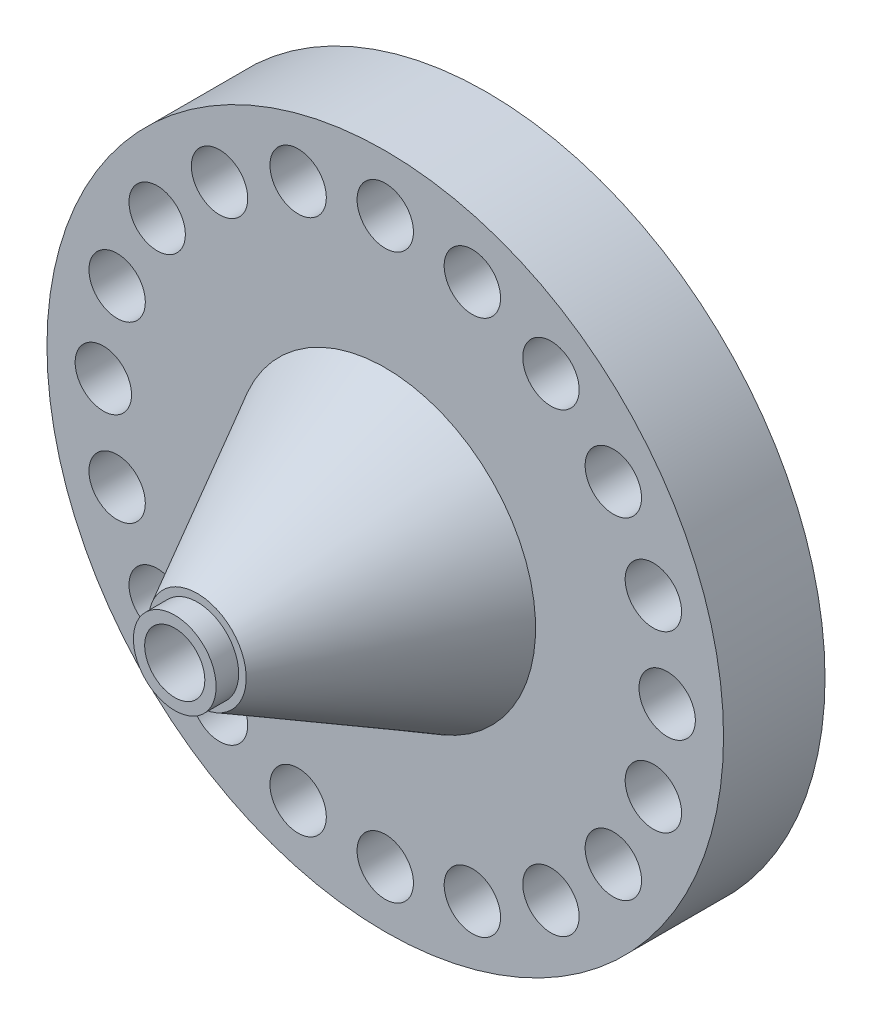
ISO-10303-21;
HEADER;
FILE_DESCRIPTION(('STEP AP214'),'2;1');
FILE_NAME('part.step','',(''),(''),'','','');
FILE_SCHEMA(('AUTOMOTIVE_DESIGN { 1 0 10303 214 1 1 1 1 }'));
ENDSEC;
DATA;
#1=APPLICATION_CONTEXT('core data for automotive mechanical design processes');
#2=APPLICATION_PROTOCOL_DEFINITION('international standard','automotive_design',2000,#1);
#3=PRODUCT_CONTEXT('',#1,'mechanical');
#4=PRODUCT('Part','Part','',(#3));
#5=PRODUCT_RELATED_PRODUCT_CATEGORY('part','',(#4));
#6=PRODUCT_DEFINITION_FORMATION('','',#4);
#7=PRODUCT_DEFINITION_CONTEXT('part definition',#1,'design');
#8=PRODUCT_DEFINITION('design','',#6,#7);
#9=PRODUCT_DEFINITION_SHAPE('','',#8);
#10=(LENGTH_UNIT() NAMED_UNIT(*) SI_UNIT(.MILLI.,.METRE.));
#11=(NAMED_UNIT(*) PLANE_ANGLE_UNIT() SI_UNIT($,.RADIAN.));
#12=(NAMED_UNIT(*) SI_UNIT($,.STERADIAN.) SOLID_ANGLE_UNIT());
#13=UNCERTAINTY_MEASURE_WITH_UNIT(LENGTH_MEASURE(1.E-05),#10,'distance_accuracy_value','');
#14=(GEOMETRIC_REPRESENTATION_CONTEXT(3) GLOBAL_UNCERTAINTY_ASSIGNED_CONTEXT((#13)) GLOBAL_UNIT_ASSIGNED_CONTEXT((#10,
#11,#12)) REPRESENTATION_CONTEXT('',''));
#15=CARTESIAN_POINT('',(0.,0.,0.));
#16=DIRECTION('',(0.,0.,1.));
#17=DIRECTION('',(1.,0.,0.));
#18=AXIS2_PLACEMENT_3D('',#15,#16,#17);
#19=CARTESIAN_POINT('',(0.,0.,-6.75));
#20=DIRECTION('',(0.,0.,1.));
#21=DIRECTION('',(1.,0.,0.));
#22=AXIS2_PLACEMENT_3D('',#19,#20,#21);
#23=CYLINDRICAL_SURFACE('',#22,4.);
#24=CARTESIAN_POINT('',(0.,0.,34.75));
#25=DIRECTION('',(0.,0.,1.));
#26=DIRECTION('',(1.,0.,0.));
#27=AXIS2_PLACEMENT_3D('',#24,#25,#26);
#28=CIRCLE('',#27,4.);
#29=CARTESIAN_POINT('',(4.,0.,34.75));
#30=VERTEX_POINT('',#29);
#31=EDGE_CURVE('E193',#30,#30,#28,.T.);
#32=ORIENTED_EDGE('',*,*,#31,.T.);
#33=EDGE_LOOP('',(#32));
#34=FACE_BOUND('',#33,.T.);
#35=CARTESIAN_POINT('',(0.,0.,-4.75));
#36=DIRECTION('',(0.,0.,-1.));
#37=DIRECTION('',(-1.,0.,0.));
#38=AXIS2_PLACEMENT_3D('',#35,#36,#37);
#39=CIRCLE('',#38,4.);
#40=CARTESIAN_POINT('',(-4.,0.,-4.75));
#41=VERTEX_POINT('',#40);
#42=EDGE_CURVE('E40',#41,#41,#39,.F.);
#43=ORIENTED_EDGE('',*,*,#42,.F.);
#44=EDGE_LOOP('',(#43));
#45=FACE_BOUND('',#44,.T.);
#46=ADVANCED_FACE('F36',(#34,#45),#23,.F.);
#47=CARTESIAN_POINT('',(0.,0.,6.75));
#48=DIRECTION('',(0.,0.,1.));
#49=DIRECTION('',(1.,0.,0.));
#50=AXIS2_PLACEMENT_3D('',#47,#48,#49);
#51=PLANE('',#50);
#52=CARTESIAN_POINT('',(-11.5881372890601,35.6646193610684,6.75));
#53=DIRECTION('',(0.,0.,1.));
#54=DIRECTION('',(1.,0.,0.));
#55=AXIS2_PLACEMENT_3D('',#52,#53,#54);
#56=CIRCLE('',#55,3.75);
#57=CARTESIAN_POINT('',(-7.83813728906006,35.6646193610684,6.75));
#58=VERTEX_POINT('',#57);
#59=EDGE_CURVE('E397',#58,#58,#56,.T.);
#60=ORIENTED_EDGE('',*,*,#59,.F.);
#61=EDGE_LOOP('',(#60));
#62=FACE_BOUND('',#61,.T.);
#63=CARTESIAN_POINT('',(-30.3381372890599,22.0419469609664,6.75));
#64=DIRECTION('',(0.,0.,1.));
#65=DIRECTION('',(1.,0.,0.));
#66=AXIS2_PLACEMENT_3D('',#63,#64,#65);
#67=CIRCLE('',#66,3.75000000000145);
#68=CARTESIAN_POINT('',(-26.5881372890584,22.0419469609664,6.75));
#69=VERTEX_POINT('',#68);
#70=EDGE_CURVE('E409',#69,#69,#67,.T.);
#71=ORIENTED_EDGE('',*,*,#70,.F.);
#72=EDGE_LOOP('',(#71));
#73=FACE_BOUND('',#72,.T.);
#74=CARTESIAN_POINT('',(-37.4999999999984,-1.59642494271182E-12,6.75));
#75=DIRECTION('',(0.,0.,1.));
#76=DIRECTION('',(1.,0.,0.));
#77=AXIS2_PLACEMENT_3D('',#74,#75,#76);
#78=CIRCLE('',#77,3.75000000000237);
#79=CARTESIAN_POINT('',(-33.749999999996,-1.59642494271182E-12,6.75));
#80=VERTEX_POINT('',#79);
#81=EDGE_CURVE('E421',#80,#80,#78,.T.);
#82=ORIENTED_EDGE('',*,*,#81,.F.);
#83=EDGE_LOOP('',(#82));
#84=FACE_BOUND('',#83,.T.);
#85=CARTESIAN_POINT('',(-30.338137289058,-22.041946960969,6.75));
#86=DIRECTION('',(0.,0.,1.));
#87=DIRECTION('',(1.,0.,0.));
#88=AXIS2_PLACEMENT_3D('',#85,#86,#87);
#89=CIRCLE('',#88,3.75000000000315);
#90=CARTESIAN_POINT('',(-26.5881372890549,-22.041946960969,6.75));
#91=VERTEX_POINT('',#90);
#92=EDGE_CURVE('E433',#91,#91,#89,.T.);
#93=ORIENTED_EDGE('',*,*,#92,.F.);
#94=EDGE_LOOP('',(#93));
#95=FACE_BOUND('',#94,.T.);
#96=CARTESIAN_POINT('',(-11.5881372890574,-35.6646193610688,6.75));
#97=DIRECTION('',(0.,0.,1.));
#98=DIRECTION('',(1.,0.,0.));
#99=AXIS2_PLACEMENT_3D('',#96,#97,#98);
#100=CIRCLE('',#99,3.7500000000034);
#101=CARTESIAN_POINT('',(-7.83813728905402,-35.6646193610688,6.75));
#102=VERTEX_POINT('',#101);
#103=EDGE_CURVE('E445',#102,#102,#100,.T.);
#104=ORIENTED_EDGE('',*,*,#103,.F.);
#105=EDGE_LOOP('',(#104));
#106=FACE_BOUND('',#105,.T.);
#107=CARTESIAN_POINT('',(11.5881372890636,-35.6646193610678,6.75));
#108=DIRECTION('',(0.,0.,1.));
#109=DIRECTION('',(1.,0.,0.));
#110=AXIS2_PLACEMENT_3D('',#107,#108,#109);
#111=CIRCLE('',#110,3.75000000000307);
#112=CARTESIAN_POINT('',(15.3381372890667,-35.6646193610678,6.75));
#113=VERTEX_POINT('',#112);
#114=EDGE_CURVE('E457',#113,#113,#111,.T.);
#115=ORIENTED_EDGE('',*,*,#114,.F.);
#116=EDGE_LOOP('',(#115));
#117=FACE_BOUND('',#116,.T.);
#118=CARTESIAN_POINT('',(30.3381372890631,-22.0419469609665,6.75));
#119=DIRECTION('',(0.,0.,1.));
#120=DIRECTION('',(1.,0.,0.));
#121=AXIS2_PLACEMENT_3D('',#118,#119,#120);
#122=CIRCLE('',#121,3.75000000000222);
#123=CARTESIAN_POINT('',(34.0881372890653,-22.0419469609665,6.75));
#124=VERTEX_POINT('',#123);
#125=EDGE_CURVE('E469',#124,#124,#122,.T.);
#126=ORIENTED_EDGE('',*,*,#125,.F.);
#127=EDGE_LOOP('',(#126));
#128=FACE_BOUND('',#127,.T.);
#129=CARTESIAN_POINT('',(37.5000000000016,1.59183251721502E-12,6.75));
#130=DIRECTION('',(0.,0.,1.));
#131=DIRECTION('',(1.,0.,0.));
#132=AXIS2_PLACEMENT_3D('',#129,#130,#131);
#133=CIRCLE('',#132,3.75000000000119);
#134=CARTESIAN_POINT('',(41.2500000000028,1.59183251721502E-12,6.75));
#135=VERTEX_POINT('',#134);
#136=EDGE_CURVE('E481',#135,#135,#133,.T.);
#137=ORIENTED_EDGE('',*,*,#136,.F.);
#138=EDGE_LOOP('',(#137));
#139=FACE_BOUND('',#138,.T.);
#140=CARTESIAN_POINT('',(30.3381372890612,22.041946960969,6.75));
#141=DIRECTION('',(0.,0.,1.));
#142=DIRECTION('',(1.,0.,0.));
#143=AXIS2_PLACEMENT_3D('',#140,#141,#142);
#144=CIRCLE('',#143,3.75000000000033);
#145=CARTESIAN_POINT('',(34.0881372890615,22.041946960969,6.75));
#146=VERTEX_POINT('',#145);
#147=EDGE_CURVE('E493',#146,#146,#144,.T.);
#148=ORIENTED_EDGE('',*,*,#147,.F.);
#149=EDGE_LOOP('',(#148));
#150=FACE_BOUND('',#149,.T.);
#151=CARTESIAN_POINT('',(11.5881372890606,35.6646193610683,6.75));
#152=DIRECTION('',(0.,0.,1.));
#153=DIRECTION('',(1.,0.,0.));
#154=AXIS2_PLACEMENT_3D('',#151,#152,#153);
#155=CIRCLE('',#154,3.75);
#156=CARTESIAN_POINT('',(15.3381372890606,35.6646193610683,6.75));
#157=VERTEX_POINT('',#156);
#158=EDGE_CURVE('E505',#157,#157,#155,.T.);
#159=ORIENTED_EDGE('',*,*,#158,.F.);
#160=EDGE_LOOP('',(#159));
#161=FACE_BOUND('',#160,.T.);
#162=CARTESIAN_POINT('',(0.,0.,6.75));
#163=DIRECTION('',(0.,0.,1.));
#164=DIRECTION('',(1.,0.,0.));
#165=AXIS2_PLACEMENT_3D('',#162,#163,#164);
#166=CIRCLE('',#165,45.);
#167=CARTESIAN_POINT('',(45.,0.,6.75));
#168=VERTEX_POINT('',#167);
#169=EDGE_CURVE('E44',#168,#168,#166,.T.);
#170=ORIENTED_EDGE('',*,*,#169,.T.);
#171=EDGE_LOOP('',(#170));
#172=FACE_BOUND('',#171,.T.);
#173=CARTESIAN_POINT('',(0.,37.5,6.75));
#174=DIRECTION('',(0.,0.,1.));
#175=DIRECTION('',(1.,0.,0.));
#176=AXIS2_PLACEMENT_3D('',#173,#174,#175);
#177=CIRCLE('',#176,3.75);
#178=CARTESIAN_POINT('',(3.75,37.5,6.75));
#179=VERTEX_POINT('',#178);
#180=EDGE_CURVE('E511',#179,#179,#177,.T.);
#181=ORIENTED_EDGE('',*,*,#180,.F.);
#182=EDGE_LOOP('',(#181));
#183=FACE_BOUND('',#182,.T.);
#184=CARTESIAN_POINT('',(22.0419469609678,30.3381372890605,6.75));
#185=DIRECTION('',(0.,0.,1.));
#186=DIRECTION('',(1.,0.,0.));
#187=AXIS2_PLACEMENT_3D('',#184,#185,#186);
#188=CIRCLE('',#187,3.75);
#189=CARTESIAN_POINT('',(25.7919469609678,30.3381372890605,6.75));
#190=VERTEX_POINT('',#189);
#191=EDGE_CURVE('E499',#190,#190,#188,.T.);
#192=ORIENTED_EDGE('',*,*,#191,.F.);
#193=EDGE_LOOP('',(#192));
#194=FACE_BOUND('',#193,.T.);
#195=CARTESIAN_POINT('',(35.6646193610694,11.588137289062,6.75));
#196=DIRECTION('',(0.,0.,1.));
#197=DIRECTION('',(1.,0.,0.));
#198=AXIS2_PLACEMENT_3D('',#195,#196,#197);
#199=CIRCLE('',#198,3.75000000000072);
#200=CARTESIAN_POINT('',(39.4146193610701,11.588137289062,6.75));
#201=VERTEX_POINT('',#200);
#202=EDGE_CURVE('E487',#201,#201,#199,.T.);
#203=ORIENTED_EDGE('',*,*,#202,.F.);
#204=EDGE_LOOP('',(#203));
#205=FACE_BOUND('',#204,.T.);
#206=CARTESIAN_POINT('',(35.6646193610703,-11.588137289059,6.75));
#207=DIRECTION('',(0.,0.,1.));
#208=DIRECTION('',(1.,0.,0.));
#209=AXIS2_PLACEMENT_3D('',#206,#207,#208);
#210=CIRCLE('',#209,3.75000000000171);
#211=CARTESIAN_POINT('',(39.414619361072,-11.588137289059,6.75));
#212=VERTEX_POINT('',#211);
#213=EDGE_CURVE('E475',#212,#212,#210,.T.);
#214=ORIENTED_EDGE('',*,*,#213,.F.);
#215=EDGE_LOOP('',(#214));
#216=FACE_BOUND('',#215,.T.);
#217=CARTESIAN_POINT('',(22.0419469609706,-30.3381372890596,6.75));
#218=DIRECTION('',(0.,0.,1.));
#219=DIRECTION('',(1.,0.,0.));
#220=AXIS2_PLACEMENT_3D('',#217,#218,#219);
#221=CIRCLE('',#220,3.75000000000269);
#222=CARTESIAN_POINT('',(25.7919469609733,-30.3381372890596,6.75));
#223=VERTEX_POINT('',#222);
#224=EDGE_CURVE('E463',#223,#223,#221,.T.);
#225=ORIENTED_EDGE('',*,*,#224,.F.);
#226=EDGE_LOOP('',(#225));
#227=FACE_BOUND('',#226,.T.);
#228=CARTESIAN_POINT('',(3.18366503443004E-12,-37.5,6.75));
#229=DIRECTION('',(0.,0.,1.));
#230=DIRECTION('',(1.,0.,0.));
#231=AXIS2_PLACEMENT_3D('',#228,#229,#230);
#232=CIRCLE('',#231,3.7500000000033);
#233=CARTESIAN_POINT('',(3.75000000000648,-37.5,6.75));
#234=VERTEX_POINT('',#233);
#235=EDGE_CURVE('E451',#234,#234,#232,.T.);
#236=ORIENTED_EDGE('',*,*,#235,.F.);
#237=EDGE_LOOP('',(#236));
#238=FACE_BOUND('',#237,.T.);
#239=CARTESIAN_POINT('',(-22.0419469609649,-30.3381372890615,6.75));
#240=DIRECTION('',(0.,0.,1.));
#241=DIRECTION('',(1.,0.,0.));
#242=AXIS2_PLACEMENT_3D('',#239,#240,#241);
#243=CIRCLE('',#242,3.75000000000334);
#244=CARTESIAN_POINT('',(-18.2919469609615,-30.3381372890615,6.75));
#245=VERTEX_POINT('',#244);
#246=EDGE_CURVE('E439',#245,#245,#243,.T.);
#247=ORIENTED_EDGE('',*,*,#246,.F.);
#248=EDGE_LOOP('',(#247));
#249=FACE_BOUND('',#248,.T.);
#250=CARTESIAN_POINT('',(-35.6646193610662,-11.588137289062,6.75));
#251=DIRECTION('',(0.,0.,1.));
#252=DIRECTION('',(1.,0.,0.));
#253=AXIS2_PLACEMENT_3D('',#250,#251,#252);
#254=CIRCLE('',#253,3.75000000000279);
#255=CARTESIAN_POINT('',(-31.9146193610634,-11.588137289062,6.75));
#256=VERTEX_POINT('',#255);
#257=EDGE_CURVE('E427',#256,#256,#254,.T.);
#258=ORIENTED_EDGE('',*,*,#257,.F.);
#259=EDGE_LOOP('',(#258));
#260=FACE_BOUND('',#259,.T.);
#261=CARTESIAN_POINT('',(-35.6646193610672,11.588137289059,6.75));
#262=DIRECTION('',(0.,0.,1.));
#263=DIRECTION('',(1.,0.,0.));
#264=AXIS2_PLACEMENT_3D('',#261,#262,#263);
#265=CIRCLE('',#264,3.75000000000191);
#266=CARTESIAN_POINT('',(-31.9146193610653,11.588137289059,6.75));
#267=VERTEX_POINT('',#266);
#268=EDGE_CURVE('E415',#267,#267,#265,.T.);
#269=ORIENTED_EDGE('',*,*,#268,.F.);
#270=EDGE_LOOP('',(#269));
#271=FACE_BOUND('',#270,.T.);
#272=CARTESIAN_POINT('',(-22.0419469609674,30.3381372890596,6.75));
#273=DIRECTION('',(0.,0.,1.));
#274=DIRECTION('',(1.,0.,0.));
#275=AXIS2_PLACEMENT_3D('',#272,#273,#274);
#276=CIRCLE('',#275,3.75000000000104);
#277=CARTESIAN_POINT('',(-18.2919469609664,30.3381372890596,6.75));
#278=VERTEX_POINT('',#277);
#279=EDGE_CURVE('E403',#278,#278,#276,.T.);
#280=ORIENTED_EDGE('',*,*,#279,.F.);
#281=EDGE_LOOP('',(#280));
#282=FACE_BOUND('',#281,.T.);
#283=CARTESIAN_POINT('',(0.,0.,6.75));
#284=DIRECTION('',(0.,0.,1.));
#285=DIRECTION('',(1.,0.,0.));
#286=AXIS2_PLACEMENT_3D('',#283,#284,#285);
#287=CIRCLE('',#286,20.);
#288=CARTESIAN_POINT('',(-20.,0.,6.75));
#289=VERTEX_POINT('',#288);
#290=EDGE_CURVE('E194',#289,#289,#287,.T.);
#291=ORIENTED_EDGE('',*,*,#290,.F.);
#292=EDGE_LOOP('',(#291));
#293=FACE_BOUND('',#292,.T.);
#294=ADVANCED_FACE('F159',(#62,#73,#84,#95,#106,#117,#128,#139,#150,#161,#172,#183,#194,#205,
#216,#227,#238,#249,#260,#271,#282,#293),#51,.T.);
#295=CARTESIAN_POINT('',(0.,0.,-6.75));
#296=DIRECTION('',(0.,0.,1.));
#297=DIRECTION('',(1.,0.,0.));
#298=AXIS2_PLACEMENT_3D('',#295,#296,#297);
#299=PLANE('',#298);
#300=CARTESIAN_POINT('',(0.,0.,-6.75));
#301=DIRECTION('',(0.,0.,-1.));
#302=DIRECTION('',(-1.,0.,0.));
#303=AXIS2_PLACEMENT_3D('',#300,#301,#302);
#304=CIRCLE('',#303,6.);
#305=CARTESIAN_POINT('',(-6.,0.,-6.75));
#306=VERTEX_POINT('',#305);
#307=EDGE_CURVE('E200',#306,#306,#304,.T.);
#308=ORIENTED_EDGE('',*,*,#307,.F.);
#309=EDGE_LOOP('',(#308));
#310=FACE_BOUND('',#309,.T.);
#311=CARTESIAN_POINT('',(0.,0.,-6.75));
#312=DIRECTION('',(0.,0.,1.));
#313=DIRECTION('',(1.,0.,0.));
#314=AXIS2_PLACEMENT_3D('',#311,#312,#313);
#315=CIRCLE('',#314,45.);
#316=CARTESIAN_POINT('',(45.,0.,-6.75));
#317=VERTEX_POINT('',#316);
#318=EDGE_CURVE('E49',#317,#317,#315,.T.);
#319=ORIENTED_EDGE('',*,*,#318,.F.);
#320=EDGE_LOOP('',(#319));
#321=FACE_BOUND('',#320,.T.);
#322=CARTESIAN_POINT('',(0.,37.5,-6.75));
#323=DIRECTION('',(0.,0.,1.));
#324=DIRECTION('',(1.,0.,0.));
#325=AXIS2_PLACEMENT_3D('',#322,#323,#324);
#326=CIRCLE('',#325,3.75);
#327=CARTESIAN_POINT('',(3.75,37.5,-6.75));
#328=VERTEX_POINT('',#327);
#329=EDGE_CURVE('E508',#328,#328,#326,.T.);
#330=ORIENTED_EDGE('',*,*,#329,.T.);
#331=EDGE_LOOP('',(#330));
#332=FACE_BOUND('',#331,.T.);
#333=CARTESIAN_POINT('',(11.5881372890606,35.6646193610683,-6.75));
#334=DIRECTION('',(0.,0.,1.));
#335=DIRECTION('',(1.,0.,0.));
#336=AXIS2_PLACEMENT_3D('',#333,#334,#335);
#337=CIRCLE('',#336,3.75);
#338=CARTESIAN_POINT('',(15.3381372890606,35.6646193610683,-6.75));
#339=VERTEX_POINT('',#338);
#340=EDGE_CURVE('E502',#339,#339,#337,.T.);
#341=ORIENTED_EDGE('',*,*,#340,.T.);
#342=EDGE_LOOP('',(#341));
#343=FACE_BOUND('',#342,.T.);
#344=CARTESIAN_POINT('',(22.0419469609678,30.3381372890605,-6.75));
#345=DIRECTION('',(0.,0.,1.));
#346=DIRECTION('',(1.,0.,0.));
#347=AXIS2_PLACEMENT_3D('',#344,#345,#346);
#348=CIRCLE('',#347,3.75);
#349=CARTESIAN_POINT('',(25.7919469609678,30.3381372890605,-6.75));
#350=VERTEX_POINT('',#349);
#351=EDGE_CURVE('E496',#350,#350,#348,.T.);
#352=ORIENTED_EDGE('',*,*,#351,.T.);
#353=EDGE_LOOP('',(#352));
#354=FACE_BOUND('',#353,.T.);
#355=CARTESIAN_POINT('',(30.3381372890612,22.041946960969,-6.75));
#356=DIRECTION('',(0.,0.,1.));
#357=DIRECTION('',(1.,0.,0.));
#358=AXIS2_PLACEMENT_3D('',#355,#356,#357);
#359=CIRCLE('',#358,3.75000000000033);
#360=CARTESIAN_POINT('',(34.0881372890615,22.041946960969,-6.75));
#361=VERTEX_POINT('',#360);
#362=EDGE_CURVE('E490',#361,#361,#359,.T.);
#363=ORIENTED_EDGE('',*,*,#362,.T.);
#364=EDGE_LOOP('',(#363));
#365=FACE_BOUND('',#364,.T.);
#366=CARTESIAN_POINT('',(35.6646193610694,11.588137289062,-6.75));
#367=DIRECTION('',(0.,0.,1.));
#368=DIRECTION('',(1.,0.,0.));
#369=AXIS2_PLACEMENT_3D('',#366,#367,#368);
#370=CIRCLE('',#369,3.75000000000072);
#371=CARTESIAN_POINT('',(39.4146193610701,11.588137289062,-6.75));
#372=VERTEX_POINT('',#371);
#373=EDGE_CURVE('E484',#372,#372,#370,.T.);
#374=ORIENTED_EDGE('',*,*,#373,.T.);
#375=EDGE_LOOP('',(#374));
#376=FACE_BOUND('',#375,.T.);
#377=CARTESIAN_POINT('',(37.5000000000016,1.59183251721502E-12,-6.75));
#378=DIRECTION('',(0.,0.,1.));
#379=DIRECTION('',(1.,0.,0.));
#380=AXIS2_PLACEMENT_3D('',#377,#378,#379);
#381=CIRCLE('',#380,3.75000000000119);
#382=CARTESIAN_POINT('',(41.2500000000028,1.59183251721502E-12,-6.75));
#383=VERTEX_POINT('',#382);
#384=EDGE_CURVE('E478',#383,#383,#381,.T.);
#385=ORIENTED_EDGE('',*,*,#384,.T.);
#386=EDGE_LOOP('',(#385));
#387=FACE_BOUND('',#386,.T.);
#388=CARTESIAN_POINT('',(35.6646193610703,-11.588137289059,-6.75));
#389=DIRECTION('',(0.,0.,1.));
#390=DIRECTION('',(1.,0.,0.));
#391=AXIS2_PLACEMENT_3D('',#388,#389,#390);
#392=CIRCLE('',#391,3.75000000000171);
#393=CARTESIAN_POINT('',(39.414619361072,-11.588137289059,-6.75));
#394=VERTEX_POINT('',#393);
#395=EDGE_CURVE('E472',#394,#394,#392,.T.);
#396=ORIENTED_EDGE('',*,*,#395,.T.);
#397=EDGE_LOOP('',(#396));
#398=FACE_BOUND('',#397,.T.);
#399=CARTESIAN_POINT('',(30.3381372890631,-22.0419469609665,-6.75));
#400=DIRECTION('',(0.,0.,1.));
#401=DIRECTION('',(1.,0.,0.));
#402=AXIS2_PLACEMENT_3D('',#399,#400,#401);
#403=CIRCLE('',#402,3.75000000000222);
#404=CARTESIAN_POINT('',(34.0881372890653,-22.0419469609665,-6.75));
#405=VERTEX_POINT('',#404);
#406=EDGE_CURVE('E466',#405,#405,#403,.T.);
#407=ORIENTED_EDGE('',*,*,#406,.T.);
#408=EDGE_LOOP('',(#407));
#409=FACE_BOUND('',#408,.T.);
#410=CARTESIAN_POINT('',(22.0419469609706,-30.3381372890596,-6.75));
#411=DIRECTION('',(0.,0.,1.));
#412=DIRECTION('',(1.,0.,0.));
#413=AXIS2_PLACEMENT_3D('',#410,#411,#412);
#414=CIRCLE('',#413,3.75000000000269);
#415=CARTESIAN_POINT('',(25.7919469609733,-30.3381372890596,-6.75));
#416=VERTEX_POINT('',#415);
#417=EDGE_CURVE('E460',#416,#416,#414,.T.);
#418=ORIENTED_EDGE('',*,*,#417,.T.);
#419=EDGE_LOOP('',(#418));
#420=FACE_BOUND('',#419,.T.);
#421=CARTESIAN_POINT('',(11.5881372890636,-35.6646193610678,-6.75));
#422=DIRECTION('',(0.,0.,1.));
#423=DIRECTION('',(1.,0.,0.));
#424=AXIS2_PLACEMENT_3D('',#421,#422,#423);
#425=CIRCLE('',#424,3.75000000000307);
#426=CARTESIAN_POINT('',(15.3381372890667,-35.6646193610678,-6.75));
#427=VERTEX_POINT('',#426);
#428=EDGE_CURVE('E454',#427,#427,#425,.T.);
#429=ORIENTED_EDGE('',*,*,#428,.T.);
#430=EDGE_LOOP('',(#429));
#431=FACE_BOUND('',#430,.T.);
#432=CARTESIAN_POINT('',(3.18366503443004E-12,-37.5,-6.75));
#433=DIRECTION('',(0.,0.,1.));
#434=DIRECTION('',(1.,0.,0.));
#435=AXIS2_PLACEMENT_3D('',#432,#433,#434);
#436=CIRCLE('',#435,3.7500000000033);
#437=CARTESIAN_POINT('',(3.75000000000648,-37.5,-6.75));
#438=VERTEX_POINT('',#437);
#439=EDGE_CURVE('E448',#438,#438,#436,.T.);
#440=ORIENTED_EDGE('',*,*,#439,.T.);
#441=EDGE_LOOP('',(#440));
#442=FACE_BOUND('',#441,.T.);
#443=CARTESIAN_POINT('',(-11.5881372890574,-35.6646193610688,-6.75));
#444=DIRECTION('',(0.,0.,1.));
#445=DIRECTION('',(1.,0.,0.));
#446=AXIS2_PLACEMENT_3D('',#443,#444,#445);
#447=CIRCLE('',#446,3.7500000000034);
#448=CARTESIAN_POINT('',(-7.83813728905402,-35.6646193610688,-6.75));
#449=VERTEX_POINT('',#448);
#450=EDGE_CURVE('E442',#449,#449,#447,.T.);
#451=ORIENTED_EDGE('',*,*,#450,.T.);
#452=EDGE_LOOP('',(#451));
#453=FACE_BOUND('',#452,.T.);
#454=CARTESIAN_POINT('',(-22.0419469609649,-30.3381372890615,-6.75));
#455=DIRECTION('',(0.,0.,1.));
#456=DIRECTION('',(1.,0.,0.));
#457=AXIS2_PLACEMENT_3D('',#454,#455,#456);
#458=CIRCLE('',#457,3.75000000000334);
#459=CARTESIAN_POINT('',(-18.2919469609615,-30.3381372890615,-6.75));
#460=VERTEX_POINT('',#459);
#461=EDGE_CURVE('E436',#460,#460,#458,.T.);
#462=ORIENTED_EDGE('',*,*,#461,.T.);
#463=EDGE_LOOP('',(#462));
#464=FACE_BOUND('',#463,.T.);
#465=CARTESIAN_POINT('',(-30.338137289058,-22.041946960969,-6.75));
#466=DIRECTION('',(0.,0.,1.));
#467=DIRECTION('',(1.,0.,0.));
#468=AXIS2_PLACEMENT_3D('',#465,#466,#467);
#469=CIRCLE('',#468,3.75000000000315);
#470=CARTESIAN_POINT('',(-26.5881372890549,-22.041946960969,-6.75));
#471=VERTEX_POINT('',#470);
#472=EDGE_CURVE('E430',#471,#471,#469,.T.);
#473=ORIENTED_EDGE('',*,*,#472,.T.);
#474=EDGE_LOOP('',(#473));
#475=FACE_BOUND('',#474,.T.);
#476=CARTESIAN_POINT('',(-35.6646193610662,-11.588137289062,-6.75));
#477=DIRECTION('',(0.,0.,1.));
#478=DIRECTION('',(1.,0.,0.));
#479=AXIS2_PLACEMENT_3D('',#476,#477,#478);
#480=CIRCLE('',#479,3.75000000000279);
#481=CARTESIAN_POINT('',(-31.9146193610634,-11.588137289062,-6.75));
#482=VERTEX_POINT('',#481);
#483=EDGE_CURVE('E424',#482,#482,#480,.T.);
#484=ORIENTED_EDGE('',*,*,#483,.T.);
#485=EDGE_LOOP('',(#484));
#486=FACE_BOUND('',#485,.T.);
#487=CARTESIAN_POINT('',(-37.4999999999984,-1.59642494271182E-12,-6.75));
#488=DIRECTION('',(0.,0.,1.));
#489=DIRECTION('',(1.,0.,0.));
#490=AXIS2_PLACEMENT_3D('',#487,#488,#489);
#491=CIRCLE('',#490,3.75000000000237);
#492=CARTESIAN_POINT('',(-33.749999999996,-1.59642494271182E-12,-6.75));
#493=VERTEX_POINT('',#492);
#494=EDGE_CURVE('E418',#493,#493,#491,.T.);
#495=ORIENTED_EDGE('',*,*,#494,.T.);
#496=EDGE_LOOP('',(#495));
#497=FACE_BOUND('',#496,.T.);
#498=CARTESIAN_POINT('',(-35.6646193610672,11.588137289059,-6.75));
#499=DIRECTION('',(0.,0.,1.));
#500=DIRECTION('',(1.,0.,0.));
#501=AXIS2_PLACEMENT_3D('',#498,#499,#500);
#502=CIRCLE('',#501,3.75000000000191);
#503=CARTESIAN_POINT('',(-31.9146193610653,11.588137289059,-6.75));
#504=VERTEX_POINT('',#503);
#505=EDGE_CURVE('E412',#504,#504,#502,.T.);
#506=ORIENTED_EDGE('',*,*,#505,.T.);
#507=EDGE_LOOP('',(#506));
#508=FACE_BOUND('',#507,.T.);
#509=CARTESIAN_POINT('',(-30.3381372890599,22.0419469609664,-6.75));
#510=DIRECTION('',(0.,0.,1.));
#511=DIRECTION('',(1.,0.,0.));
#512=AXIS2_PLACEMENT_3D('',#509,#510,#511);
#513=CIRCLE('',#512,3.75000000000145);
#514=CARTESIAN_POINT('',(-26.5881372890584,22.0419469609664,-6.75));
#515=VERTEX_POINT('',#514);
#516=EDGE_CURVE('E406',#515,#515,#513,.T.);
#517=ORIENTED_EDGE('',*,*,#516,.T.);
#518=EDGE_LOOP('',(#517));
#519=FACE_BOUND('',#518,.T.);
#520=CARTESIAN_POINT('',(-22.0419469609674,30.3381372890596,-6.75));
#521=DIRECTION('',(0.,0.,1.));
#522=DIRECTION('',(1.,0.,0.));
#523=AXIS2_PLACEMENT_3D('',#520,#521,#522);
#524=CIRCLE('',#523,3.75000000000104);
#525=CARTESIAN_POINT('',(-18.2919469609664,30.3381372890596,-6.75));
#526=VERTEX_POINT('',#525);
#527=EDGE_CURVE('E400',#526,#526,#524,.T.);
#528=ORIENTED_EDGE('',*,*,#527,.T.);
#529=EDGE_LOOP('',(#528));
#530=FACE_BOUND('',#529,.T.);
#531=CARTESIAN_POINT('',(-11.5881372890601,35.6646193610684,-6.75));
#532=DIRECTION('',(0.,0.,1.));
#533=DIRECTION('',(1.,0.,0.));
#534=AXIS2_PLACEMENT_3D('',#531,#532,#533);
#535=CIRCLE('',#534,3.75);
#536=CARTESIAN_POINT('',(-7.83813728906006,35.6646193610684,-6.75));
#537=VERTEX_POINT('',#536);
#538=EDGE_CURVE('E390',#537,#537,#535,.T.);
#539=ORIENTED_EDGE('',*,*,#538,.T.);
#540=EDGE_LOOP('',(#539));
#541=FACE_BOUND('',#540,.T.);
#542=ADVANCED_FACE('F161',(#310,#321,#332,#343,#354,#365,#376,#387,#398,#409,#420,#431,#442,
#453,#464,#475,#486,#497,#508,#519,#530,#541),#299,.F.);
#543=CARTESIAN_POINT('',(0.,0.,6.75));
#544=DIRECTION('',(0.,0.,-1.));
#545=DIRECTION('',(-1.,0.,0.));
#546=AXIS2_PLACEMENT_3D('',#543,#544,#545);
#547=CYLINDRICAL_SURFACE('',#546,45.);
#548=ORIENTED_EDGE('',*,*,#169,.F.);
#549=EDGE_LOOP('',(#548));
#550=FACE_BOUND('',#549,.T.);
#551=ORIENTED_EDGE('',*,*,#318,.T.);
#552=EDGE_LOOP('',(#551));
#553=FACE_BOUND('',#552,.T.);
#554=ADVANCED_FACE('F38',(#550,#553),#547,.T.);
#555=CARTESIAN_POINT('',(0.,37.5,6.75));
#556=DIRECTION('',(0.,0.,-1.));
#557=DIRECTION('',(-1.,0.,0.));
#558=AXIS2_PLACEMENT_3D('',#555,#556,#557);
#559=CYLINDRICAL_SURFACE('',#558,3.75);
#560=ORIENTED_EDGE('',*,*,#180,.T.);
#561=EDGE_LOOP('',(#560));
#562=FACE_BOUND('',#561,.T.);
#563=ORIENTED_EDGE('',*,*,#329,.F.);
#564=EDGE_LOOP('',(#563));
#565=FACE_BOUND('',#564,.T.);
#566=ADVANCED_FACE('F154',(#562,#565),#559,.F.);
#567=CARTESIAN_POINT('',(11.5881372890606,35.6646193610683,6.75));
#568=DIRECTION('',(0.,0.,-1.));
#569=DIRECTION('',(-1.,0.,0.));
#570=AXIS2_PLACEMENT_3D('',#567,#568,#569);
#571=CYLINDRICAL_SURFACE('',#570,3.75);
#572=ORIENTED_EDGE('',*,*,#158,.T.);
#573=EDGE_LOOP('',(#572));
#574=FACE_BOUND('',#573,.T.);
#575=ORIENTED_EDGE('',*,*,#340,.F.);
#576=EDGE_LOOP('',(#575));
#577=FACE_BOUND('',#576,.T.);
#578=ADVANCED_FACE('F150',(#574,#577),#571,.F.);
#579=CARTESIAN_POINT('',(22.0419469609678,30.3381372890605,6.75));
#580=DIRECTION('',(0.,0.,-1.));
#581=DIRECTION('',(-1.,0.,0.));
#582=AXIS2_PLACEMENT_3D('',#579,#580,#581);
#583=CYLINDRICAL_SURFACE('',#582,3.75);
#584=ORIENTED_EDGE('',*,*,#191,.T.);
#585=EDGE_LOOP('',(#584));
#586=FACE_BOUND('',#585,.T.);
#587=ORIENTED_EDGE('',*,*,#351,.F.);
#588=EDGE_LOOP('',(#587));
#589=FACE_BOUND('',#588,.T.);
#590=ADVANCED_FACE('F146',(#586,#589),#583,.F.);
#591=CARTESIAN_POINT('',(30.3381372890612,22.041946960969,6.75));
#592=DIRECTION('',(0.,0.,-1.));
#593=DIRECTION('',(-1.,0.,0.));
#594=AXIS2_PLACEMENT_3D('',#591,#592,#593);
#595=CYLINDRICAL_SURFACE('',#594,3.75000000000033);
#596=ORIENTED_EDGE('',*,*,#147,.T.);
#597=EDGE_LOOP('',(#596));
#598=FACE_BOUND('',#597,.T.);
#599=ORIENTED_EDGE('',*,*,#362,.F.);
#600=EDGE_LOOP('',(#599));
#601=FACE_BOUND('',#600,.T.);
#602=ADVANCED_FACE('F142',(#598,#601),#595,.F.);
#603=CARTESIAN_POINT('',(35.6646193610694,11.588137289062,6.75));
#604=DIRECTION('',(0.,0.,-1.));
#605=DIRECTION('',(-1.,0.,0.));
#606=AXIS2_PLACEMENT_3D('',#603,#604,#605);
#607=CYLINDRICAL_SURFACE('',#606,3.75000000000072);
#608=ORIENTED_EDGE('',*,*,#202,.T.);
#609=EDGE_LOOP('',(#608));
#610=FACE_BOUND('',#609,.T.);
#611=ORIENTED_EDGE('',*,*,#373,.F.);
#612=EDGE_LOOP('',(#611));
#613=FACE_BOUND('',#612,.T.);
#614=ADVANCED_FACE('F138',(#610,#613),#607,.F.);
#615=CARTESIAN_POINT('',(37.5000000000016,1.59183251721502E-12,6.75));
#616=DIRECTION('',(0.,0.,-1.));
#617=DIRECTION('',(-1.,0.,0.));
#618=AXIS2_PLACEMENT_3D('',#615,#616,#617);
#619=CYLINDRICAL_SURFACE('',#618,3.75000000000119);
#620=ORIENTED_EDGE('',*,*,#136,.T.);
#621=EDGE_LOOP('',(#620));
#622=FACE_BOUND('',#621,.T.);
#623=ORIENTED_EDGE('',*,*,#384,.F.);
#624=EDGE_LOOP('',(#623));
#625=FACE_BOUND('',#624,.T.);
#626=ADVANCED_FACE('F134',(#622,#625),#619,.F.);
#627=CARTESIAN_POINT('',(35.6646193610703,-11.588137289059,6.75));
#628=DIRECTION('',(0.,0.,-1.));
#629=DIRECTION('',(-1.,0.,0.));
#630=AXIS2_PLACEMENT_3D('',#627,#628,#629);
#631=CYLINDRICAL_SURFACE('',#630,3.75000000000171);
#632=ORIENTED_EDGE('',*,*,#213,.T.);
#633=EDGE_LOOP('',(#632));
#634=FACE_BOUND('',#633,.T.);
#635=ORIENTED_EDGE('',*,*,#395,.F.);
#636=EDGE_LOOP('',(#635));
#637=FACE_BOUND('',#636,.T.);
#638=ADVANCED_FACE('F130',(#634,#637),#631,.F.);
#639=CARTESIAN_POINT('',(30.3381372890631,-22.0419469609665,6.75));
#640=DIRECTION('',(0.,0.,-1.));
#641=DIRECTION('',(-1.,0.,0.));
#642=AXIS2_PLACEMENT_3D('',#639,#640,#641);
#643=CYLINDRICAL_SURFACE('',#642,3.75000000000222);
#644=ORIENTED_EDGE('',*,*,#125,.T.);
#645=EDGE_LOOP('',(#644));
#646=FACE_BOUND('',#645,.T.);
#647=ORIENTED_EDGE('',*,*,#406,.F.);
#648=EDGE_LOOP('',(#647));
#649=FACE_BOUND('',#648,.T.);
#650=ADVANCED_FACE('F126',(#646,#649),#643,.F.);
#651=CARTESIAN_POINT('',(22.0419469609706,-30.3381372890596,6.75));
#652=DIRECTION('',(0.,0.,-1.));
#653=DIRECTION('',(-1.,0.,0.));
#654=AXIS2_PLACEMENT_3D('',#651,#652,#653);
#655=CYLINDRICAL_SURFACE('',#654,3.75000000000269);
#656=ORIENTED_EDGE('',*,*,#224,.T.);
#657=EDGE_LOOP('',(#656));
#658=FACE_BOUND('',#657,.T.);
#659=ORIENTED_EDGE('',*,*,#417,.F.);
#660=EDGE_LOOP('',(#659));
#661=FACE_BOUND('',#660,.T.);
#662=ADVANCED_FACE('F122',(#658,#661),#655,.F.);
#663=CARTESIAN_POINT('',(11.5881372890636,-35.6646193610678,6.75));
#664=DIRECTION('',(0.,0.,-1.));
#665=DIRECTION('',(-1.,0.,0.));
#666=AXIS2_PLACEMENT_3D('',#663,#664,#665);
#667=CYLINDRICAL_SURFACE('',#666,3.75000000000307);
#668=ORIENTED_EDGE('',*,*,#114,.T.);
#669=EDGE_LOOP('',(#668));
#670=FACE_BOUND('',#669,.T.);
#671=ORIENTED_EDGE('',*,*,#428,.F.);
#672=EDGE_LOOP('',(#671));
#673=FACE_BOUND('',#672,.T.);
#674=ADVANCED_FACE('F118',(#670,#673),#667,.F.);
#675=CARTESIAN_POINT('',(3.18366503443004E-12,-37.5,6.75));
#676=DIRECTION('',(0.,0.,-1.));
#677=DIRECTION('',(-1.,0.,0.));
#678=AXIS2_PLACEMENT_3D('',#675,#676,#677);
#679=CYLINDRICAL_SURFACE('',#678,3.7500000000033);
#680=ORIENTED_EDGE('',*,*,#235,.T.);
#681=EDGE_LOOP('',(#680));
#682=FACE_BOUND('',#681,.T.);
#683=ORIENTED_EDGE('',*,*,#439,.F.);
#684=EDGE_LOOP('',(#683));
#685=FACE_BOUND('',#684,.T.);
#686=ADVANCED_FACE('F114',(#682,#685),#679,.F.);
#687=CARTESIAN_POINT('',(-11.5881372890574,-35.6646193610688,6.75));
#688=DIRECTION('',(0.,0.,-1.));
#689=DIRECTION('',(-1.,0.,0.));
#690=AXIS2_PLACEMENT_3D('',#687,#688,#689);
#691=CYLINDRICAL_SURFACE('',#690,3.7500000000034);
#692=ORIENTED_EDGE('',*,*,#103,.T.);
#693=EDGE_LOOP('',(#692));
#694=FACE_BOUND('',#693,.T.);
#695=ORIENTED_EDGE('',*,*,#450,.F.);
#696=EDGE_LOOP('',(#695));
#697=FACE_BOUND('',#696,.T.);
#698=ADVANCED_FACE('F110',(#694,#697),#691,.F.);
#699=CARTESIAN_POINT('',(-22.0419469609649,-30.3381372890615,6.75));
#700=DIRECTION('',(0.,0.,-1.));
#701=DIRECTION('',(-1.,0.,0.));
#702=AXIS2_PLACEMENT_3D('',#699,#700,#701);
#703=CYLINDRICAL_SURFACE('',#702,3.75000000000334);
#704=ORIENTED_EDGE('',*,*,#246,.T.);
#705=EDGE_LOOP('',(#704));
#706=FACE_BOUND('',#705,.T.);
#707=ORIENTED_EDGE('',*,*,#461,.F.);
#708=EDGE_LOOP('',(#707));
#709=FACE_BOUND('',#708,.T.);
#710=ADVANCED_FACE('F106',(#706,#709),#703,.F.);
#711=CARTESIAN_POINT('',(-30.338137289058,-22.041946960969,6.75));
#712=DIRECTION('',(0.,0.,-1.));
#713=DIRECTION('',(-1.,0.,0.));
#714=AXIS2_PLACEMENT_3D('',#711,#712,#713);
#715=CYLINDRICAL_SURFACE('',#714,3.75000000000315);
#716=ORIENTED_EDGE('',*,*,#92,.T.);
#717=EDGE_LOOP('',(#716));
#718=FACE_BOUND('',#717,.T.);
#719=ORIENTED_EDGE('',*,*,#472,.F.);
#720=EDGE_LOOP('',(#719));
#721=FACE_BOUND('',#720,.T.);
#722=ADVANCED_FACE('F102',(#718,#721),#715,.F.);
#723=CARTESIAN_POINT('',(-35.6646193610662,-11.588137289062,6.75));
#724=DIRECTION('',(0.,0.,-1.));
#725=DIRECTION('',(-1.,0.,0.));
#726=AXIS2_PLACEMENT_3D('',#723,#724,#725);
#727=CYLINDRICAL_SURFACE('',#726,3.75000000000279);
#728=ORIENTED_EDGE('',*,*,#257,.T.);
#729=EDGE_LOOP('',(#728));
#730=FACE_BOUND('',#729,.T.);
#731=ORIENTED_EDGE('',*,*,#483,.F.);
#732=EDGE_LOOP('',(#731));
#733=FACE_BOUND('',#732,.T.);
#734=ADVANCED_FACE('F98',(#730,#733),#727,.F.);
#735=CARTESIAN_POINT('',(-37.4999999999984,-1.59642494271182E-12,6.75));
#736=DIRECTION('',(0.,0.,-1.));
#737=DIRECTION('',(-1.,0.,0.));
#738=AXIS2_PLACEMENT_3D('',#735,#736,#737);
#739=CYLINDRICAL_SURFACE('',#738,3.75000000000237);
#740=ORIENTED_EDGE('',*,*,#81,.T.);
#741=EDGE_LOOP('',(#740));
#742=FACE_BOUND('',#741,.T.);
#743=ORIENTED_EDGE('',*,*,#494,.F.);
#744=EDGE_LOOP('',(#743));
#745=FACE_BOUND('',#744,.T.);
#746=ADVANCED_FACE('F94',(#742,#745),#739,.F.);
#747=CARTESIAN_POINT('',(-35.6646193610672,11.588137289059,6.75));
#748=DIRECTION('',(0.,0.,-1.));
#749=DIRECTION('',(-1.,0.,0.));
#750=AXIS2_PLACEMENT_3D('',#747,#748,#749);
#751=CYLINDRICAL_SURFACE('',#750,3.75000000000191);
#752=ORIENTED_EDGE('',*,*,#268,.T.);
#753=EDGE_LOOP('',(#752));
#754=FACE_BOUND('',#753,.T.);
#755=ORIENTED_EDGE('',*,*,#505,.F.);
#756=EDGE_LOOP('',(#755));
#757=FACE_BOUND('',#756,.T.);
#758=ADVANCED_FACE('F90',(#754,#757),#751,.F.);
#759=CARTESIAN_POINT('',(-30.3381372890599,22.0419469609664,6.75));
#760=DIRECTION('',(0.,0.,-1.));
#761=DIRECTION('',(-1.,0.,0.));
#762=AXIS2_PLACEMENT_3D('',#759,#760,#761);
#763=CYLINDRICAL_SURFACE('',#762,3.75000000000145);
#764=ORIENTED_EDGE('',*,*,#70,.T.);
#765=EDGE_LOOP('',(#764));
#766=FACE_BOUND('',#765,.T.);
#767=ORIENTED_EDGE('',*,*,#516,.F.);
#768=EDGE_LOOP('',(#767));
#769=FACE_BOUND('',#768,.T.);
#770=ADVANCED_FACE('F86',(#766,#769),#763,.F.);
#771=CARTESIAN_POINT('',(-22.0419469609674,30.3381372890596,6.75));
#772=DIRECTION('',(0.,0.,-1.));
#773=DIRECTION('',(-1.,0.,0.));
#774=AXIS2_PLACEMENT_3D('',#771,#772,#773);
#775=CYLINDRICAL_SURFACE('',#774,3.75000000000104);
#776=ORIENTED_EDGE('',*,*,#279,.T.);
#777=EDGE_LOOP('',(#776));
#778=FACE_BOUND('',#777,.T.);
#779=ORIENTED_EDGE('',*,*,#527,.F.);
#780=EDGE_LOOP('',(#779));
#781=FACE_BOUND('',#780,.T.);
#782=ADVANCED_FACE('F82',(#778,#781),#775,.F.);
#783=CARTESIAN_POINT('',(-11.5881372890601,35.6646193610684,6.75));
#784=DIRECTION('',(0.,0.,-1.));
#785=DIRECTION('',(-1.,0.,0.));
#786=AXIS2_PLACEMENT_3D('',#783,#784,#785);
#787=CYLINDRICAL_SURFACE('',#786,3.75);
#788=ORIENTED_EDGE('',*,*,#59,.T.);
#789=EDGE_LOOP('',(#788));
#790=FACE_BOUND('',#789,.T.);
#791=ORIENTED_EDGE('',*,*,#538,.F.);
#792=EDGE_LOOP('',(#791));
#793=FACE_BOUND('',#792,.T.);
#794=ADVANCED_FACE('F79',(#790,#793),#787,.F.);
#795=CARTESIAN_POINT('',(0.,0.,31.75));
#796=DIRECTION('',(0.,0.,1.));
#797=DIRECTION('',(1.,0.,0.));
#798=AXIS2_PLACEMENT_3D('',#795,#796,#797);
#799=PLANE('',#798);
#800=CARTESIAN_POINT('',(0.,0.,31.75));
#801=DIRECTION('',(0.,0.,1.));
#802=DIRECTION('',(1.,0.,0.));
#803=AXIS2_PLACEMENT_3D('',#800,#801,#802);
#804=CIRCLE('',#803,5.5);
#805=CARTESIAN_POINT('',(5.5,0.,31.75));
#806=VERTEX_POINT('',#805);
#807=EDGE_CURVE('E11',#806,#806,#804,.T.);
#808=ORIENTED_EDGE('',*,*,#807,.F.);
#809=EDGE_LOOP('',(#808));
#810=FACE_BOUND('',#809,.T.);
#811=CARTESIAN_POINT('',(0.,0.,31.75));
#812=DIRECTION('',(0.,0.,1.));
#813=DIRECTION('',(1.,0.,0.));
#814=AXIS2_PLACEMENT_3D('',#811,#812,#813);
#815=CIRCLE('',#814,6.5);
#816=CARTESIAN_POINT('',(-6.5,0.,31.75));
#817=VERTEX_POINT('',#816);
#818=EDGE_CURVE('E59',#817,#817,#815,.T.);
#819=ORIENTED_EDGE('',*,*,#818,.T.);
#820=EDGE_LOOP('',(#819));
#821=FACE_BOUND('',#820,.T.);
#822=ADVANCED_FACE('F76',(#810,#821),#799,.T.);
#823=CARTESIAN_POINT('',(0.,0.,31.75));
#824=DIRECTION('',(0.,0.,-1.));
#825=DIRECTION('',(-1.,0.,0.));
#826=AXIS2_PLACEMENT_3D('',#823,#824,#825);
#827=CONICAL_SURFACE('',#826,6.5,0.495133263468404);
#828=CARTESIAN_POINT('',(-6.5,0.,31.75));
#829=CARTESIAN_POINT('',(-6.640625,0.,31.4895833333333));
#830=CARTESIAN_POINT('',(-6.78125,0.,31.2291666666667));
#831=CARTESIAN_POINT('',(-7.0625,0.,30.7083333333333));
#832=CARTESIAN_POINT('',(-7.203125,0.,30.4479166666667));
#833=CARTESIAN_POINT('',(-7.484375,0.,29.9270833333333));
#834=CARTESIAN_POINT('',(-7.625,0.,29.6666666666667));
#835=CARTESIAN_POINT('',(-7.90625,0.,29.1458333333333));
#836=CARTESIAN_POINT('',(-8.046875,0.,28.8854166666667));
#837=CARTESIAN_POINT('',(-8.328125,0.,28.3645833333333));
#838=CARTESIAN_POINT('',(-8.46875,0.,28.1041666666667));
#839=CARTESIAN_POINT('',(-8.75,0.,27.5833333333333));
#840=CARTESIAN_POINT('',(-8.890625,0.,27.3229166666667));
#841=CARTESIAN_POINT('',(-9.171875,0.,26.8020833333333));
#842=CARTESIAN_POINT('',(-9.3125,0.,26.5416666666667));
#843=CARTESIAN_POINT('',(-9.59375,0.,26.0208333333333));
#844=CARTESIAN_POINT('',(-9.734375,0.,25.7604166666667));
#845=CARTESIAN_POINT('',(-10.015625,0.,25.2395833333333));
#846=CARTESIAN_POINT('',(-10.15625,0.,24.9791666666667));
#847=CARTESIAN_POINT('',(-10.4375,0.,24.4583333333333));
#848=CARTESIAN_POINT('',(-10.578125,0.,24.1979166666667));
#849=CARTESIAN_POINT('',(-10.859375,0.,23.6770833333333));
#850=CARTESIAN_POINT('',(-11.,0.,23.4166666666667));
#851=CARTESIAN_POINT('',(-11.28125,0.,22.8958333333333));
#852=CARTESIAN_POINT('',(-11.421875,0.,22.6354166666667));
#853=CARTESIAN_POINT('',(-11.703125,0.,22.1145833333333));
#854=CARTESIAN_POINT('',(-11.84375,0.,21.8541666666667));
#855=CARTESIAN_POINT('',(-12.125,0.,21.3333333333333));
#856=CARTESIAN_POINT('',(-12.265625,0.,21.0729166666667));
#857=CARTESIAN_POINT('',(-12.546875,0.,20.5520833333333));
#858=CARTESIAN_POINT('',(-12.6875,0.,20.2916666666667));
#859=CARTESIAN_POINT('',(-12.96875,0.,19.7708333333333));
#860=CARTESIAN_POINT('',(-13.109375,0.,19.5104166666667));
#861=CARTESIAN_POINT('',(-13.390625,0.,18.9895833333333));
#862=CARTESIAN_POINT('',(-13.53125,0.,18.7291666666667));
#863=CARTESIAN_POINT('',(-13.8125,0.,18.2083333333333));
#864=CARTESIAN_POINT('',(-13.953125,0.,17.9479166666667));
#865=CARTESIAN_POINT('',(-14.234375,0.,17.4270833333333));
#866=CARTESIAN_POINT('',(-14.375,0.,17.1666666666667));
#867=CARTESIAN_POINT('',(-14.65625,0.,16.6458333333333));
#868=CARTESIAN_POINT('',(-14.796875,0.,16.3854166666667));
#869=CARTESIAN_POINT('',(-15.078125,0.,15.8645833333333));
#870=CARTESIAN_POINT('',(-15.21875,0.,15.6041666666667));
#871=CARTESIAN_POINT('',(-15.5,0.,15.0833333333333));
#872=CARTESIAN_POINT('',(-15.640625,0.,14.8229166666667));
#873=CARTESIAN_POINT('',(-15.921875,0.,14.3020833333333));
#874=CARTESIAN_POINT('',(-16.0625,0.,14.0416666666667));
#875=CARTESIAN_POINT('',(-16.34375,0.,13.5208333333333));
#876=CARTESIAN_POINT('',(-16.484375,0.,13.2604166666667));
#877=CARTESIAN_POINT('',(-16.765625,0.,12.7395833333333));
#878=CARTESIAN_POINT('',(-16.90625,0.,12.4791666666667));
#879=CARTESIAN_POINT('',(-17.1875,0.,11.9583333333333));
#880=CARTESIAN_POINT('',(-17.328125,0.,11.6979166666667));
#881=CARTESIAN_POINT('',(-17.609375,0.,11.1770833333333));
#882=CARTESIAN_POINT('',(-17.75,0.,10.9166666666667));
#883=CARTESIAN_POINT('',(-18.03125,0.,10.3958333333333));
#884=CARTESIAN_POINT('',(-18.171875,0.,10.1354166666667));
#885=CARTESIAN_POINT('',(-18.453125,0.,9.61458333333333));
#886=CARTESIAN_POINT('',(-18.59375,0.,9.35416666666666));
#887=CARTESIAN_POINT('',(-18.875,0.,8.83333333333333));
#888=CARTESIAN_POINT('',(-19.015625,0.,8.57291666666667));
#889=CARTESIAN_POINT('',(-19.296875,0.,8.05208333333333));
#890=CARTESIAN_POINT('',(-19.4375,0.,7.79166666666667));
#891=CARTESIAN_POINT('',(-19.71875,0.,7.27083333333333));
#892=CARTESIAN_POINT('',(-19.859375,0.,7.01041666666667));
#893=CARTESIAN_POINT('',(-20.,0.,6.75));
#894=B_SPLINE_CURVE_WITH_KNOTS('',3,(#828,#829,#830,#831,#832,#833,#834,#835,#836,#837,#838,
#839,#840,#841,#842,#843,#844,#845,#846,#847,#848,#849,#850,#851,#852,#853,#854,#855,#856,#857,
#858,#859,#860,#861,#862,#863,#864,#865,#866,#867,#868,#869,#870,#871,#872,#873,#874,#875,#876,
#877,#878,#879,#880,#881,#882,#883,#884,#885,#886,#887,#888,#889,#890,#891,#892,#893),
.UNSPECIFIED.,.F.,.F.,(4,2,2,2,2,2,2,2,2,2,2,2,2,2,2,2,2,2,2,2,2,2,2,2,2,2,2,2,2,2,2,2,4),(0.,
0.887879540323465,1.77575908064693,2.66363862097038,3.55151816129385,4.43939770161731,
5.32727724194077,6.21515678226423,7.10303632258769,7.99091586291115,8.87879540323461,
9.76667494355807,10.6545544838815,11.542434024205,12.4303135645285,13.3181931048519,
14.2060726451754,15.0939521854988,15.9818317258223,16.8697112661458,17.7575908064692,
18.6454703467927,19.5333498871161,20.4212294274396,21.3091089677631,22.1969885080865,
23.08486804841,23.9727475887334,24.8606271290569,25.7485066693804,26.6363862097038,
27.5242657500273,28.4121452903507),.UNSPECIFIED.);
#895=EDGE_CURVE('BSEAM65',#817,#289,#894,.T.);
#896=ORIENTED_EDGE('',*,*,#818,.F.);
#897=ORIENTED_EDGE('',*,*,#290,.T.);
#898=ORIENTED_EDGE('',*,*,#895,.T.);
#899=ORIENTED_EDGE('',*,*,#895,.F.);
#900=EDGE_LOOP('',(#896,#898,#897,#899));
#901=FACE_BOUND('',#900,.T.);
#902=ADVANCED_FACE('F65',(#901),#827,.T.);
#903=CARTESIAN_POINT('',(0.,0.,34.75));
#904=DIRECTION('',(0.,0.,-1.));
#905=DIRECTION('',(-1.,0.,0.));
#906=AXIS2_PLACEMENT_3D('',#903,#904,#905);
#907=CYLINDRICAL_SURFACE('',#906,5.5);
#908=CARTESIAN_POINT('',(0.,0.,34.75));
#909=DIRECTION('',(0.,0.,1.));
#910=DIRECTION('',(1.,0.,0.));
#911=AXIS2_PLACEMENT_3D('',#908,#909,#910);
#912=CIRCLE('',#911,5.5);
#913=CARTESIAN_POINT('',(5.5,0.,34.75));
#914=VERTEX_POINT('',#913);
#915=EDGE_CURVE('E53',#914,#914,#912,.T.);
#916=ORIENTED_EDGE('',*,*,#915,.F.);
#917=EDGE_LOOP('',(#916));
#918=FACE_BOUND('',#917,.T.);
#919=ORIENTED_EDGE('',*,*,#807,.T.);
#920=EDGE_LOOP('',(#919));
#921=FACE_BOUND('',#920,.T.);
#922=ADVANCED_FACE('F75',(#918,#921),#907,.T.);
#923=CARTESIAN_POINT('',(0.,0.,34.75));
#924=DIRECTION('',(0.,0.,1.));
#925=DIRECTION('',(1.,0.,0.));
#926=AXIS2_PLACEMENT_3D('',#923,#924,#925);
#927=PLANE('',#926);
#928=ORIENTED_EDGE('',*,*,#31,.F.);
#929=EDGE_LOOP('',(#928));
#930=FACE_BOUND('',#929,.T.);
#931=ORIENTED_EDGE('',*,*,#915,.T.);
#932=EDGE_LOOP('',(#931));
#933=FACE_BOUND('',#932,.T.);
#934=ADVANCED_FACE('F182',(#930,#933),#927,.T.);
#935=CARTESIAN_POINT('',(0.,0.,-4.75));
#936=DIRECTION('',(0.,0.,-1.));
#937=DIRECTION('',(-1.,0.,0.));
#938=AXIS2_PLACEMENT_3D('',#935,#936,#937);
#939=PLANE('',#938);
#940=CARTESIAN_POINT('',(0.,0.,-4.75));
#941=DIRECTION('',(0.,0.,-1.));
#942=DIRECTION('',(-1.,0.,0.));
#943=AXIS2_PLACEMENT_3D('',#940,#941,#942);
#944=CIRCLE('',#943,6.);
#945=CARTESIAN_POINT('',(-6.,0.,-4.75));
#946=VERTEX_POINT('',#945);
#947=EDGE_CURVE('E198',#946,#946,#944,.T.);
#948=ORIENTED_EDGE('',*,*,#947,.T.);
#949=EDGE_LOOP('',(#948));
#950=FACE_BOUND('',#949,.T.);
#951=ORIENTED_EDGE('',*,*,#42,.T.);
#952=EDGE_LOOP('',(#951));
#953=FACE_BOUND('',#952,.T.);
#954=ADVANCED_FACE('F184',(#950,#953),#939,.T.);
#955=CARTESIAN_POINT('',(0.,0.,-4.75));
#956=DIRECTION('',(0.,0.,-1.));
#957=DIRECTION('',(-1.,0.,0.));
#958=AXIS2_PLACEMENT_3D('',#955,#956,#957);
#959=CYLINDRICAL_SURFACE('',#958,6.);
#960=ORIENTED_EDGE('',*,*,#947,.F.);
#961=EDGE_LOOP('',(#960));
#962=FACE_BOUND('',#961,.T.);
#963=ORIENTED_EDGE('',*,*,#307,.T.);
#964=EDGE_LOOP('',(#963));
#965=FACE_BOUND('',#964,.T.);
#966=ADVANCED_FACE('F180',(#962,#965),#959,.F.);
#967=CLOSED_SHELL('',(#46,#294,#542,#554,#566,#578,#590,#602,#614,#626,#638,#650,#662,#674,#686,
#698,#710,#722,#734,#746,#758,#770,#782,#794,#822,#902,#922,#934,#954,#966));
#968=MANIFOLD_SOLID_BREP('B2',#967);
#969=ADVANCED_BREP_SHAPE_REPRESENTATION('',(#18,#968),#14);
#970=SHAPE_DEFINITION_REPRESENTATION(#9,#969);
ENDSEC;
END-ISO-10303-21;
